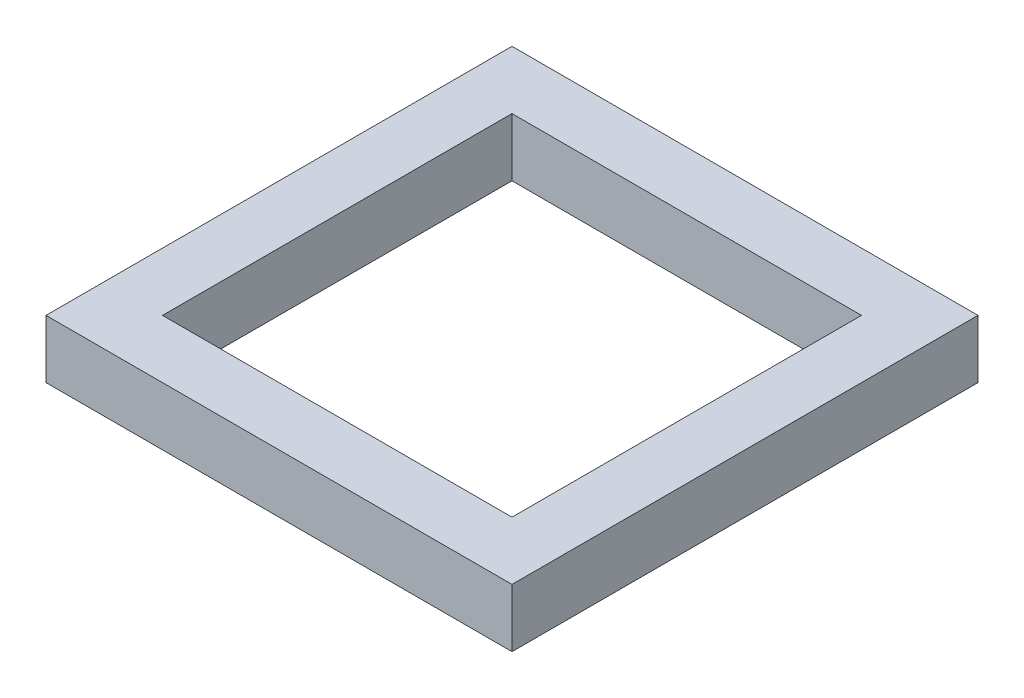
ISO-10303-21;
HEADER;
FILE_DESCRIPTION(('STEP AP214'),'2;1');
FILE_NAME('part.step','',(''),(''),'','','');
FILE_SCHEMA(('AUTOMOTIVE_DESIGN { 1 0 10303 214 1 1 1 1 }'));
ENDSEC;
DATA;
#1=APPLICATION_CONTEXT('core data for automotive mechanical design processes');
#2=APPLICATION_PROTOCOL_DEFINITION('international standard','automotive_design',2000,#1);
#3=PRODUCT_CONTEXT('',#1,'mechanical');
#4=PRODUCT('Part','Part','',(#3));
#5=PRODUCT_RELATED_PRODUCT_CATEGORY('part','',(#4));
#6=PRODUCT_DEFINITION_FORMATION('','',#4);
#7=PRODUCT_DEFINITION_CONTEXT('part definition',#1,'design');
#8=PRODUCT_DEFINITION('design','',#6,#7);
#9=PRODUCT_DEFINITION_SHAPE('','',#8);
#10=(LENGTH_UNIT() NAMED_UNIT(*) SI_UNIT(.MILLI.,.METRE.));
#11=(NAMED_UNIT(*) PLANE_ANGLE_UNIT() SI_UNIT($,.RADIAN.));
#12=(NAMED_UNIT(*) SI_UNIT($,.STERADIAN.) SOLID_ANGLE_UNIT());
#13=UNCERTAINTY_MEASURE_WITH_UNIT(LENGTH_MEASURE(1.E-05),#10,'distance_accuracy_value','');
#14=(GEOMETRIC_REPRESENTATION_CONTEXT(3) GLOBAL_UNCERTAINTY_ASSIGNED_CONTEXT((#13)) GLOBAL_UNIT_ASSIGNED_CONTEXT((#10,
#11,#12)) REPRESENTATION_CONTEXT('',''));
#15=CARTESIAN_POINT('',(0.,0.,0.));
#16=DIRECTION('',(0.,0.,1.));
#17=DIRECTION('',(1.,0.,0.));
#18=AXIS2_PLACEMENT_3D('',#15,#16,#17);
#19=CARTESIAN_POINT('',(-200.,628.685424933238,200.));
#20=DIRECTION('',(0.,0.,-1.));
#21=DIRECTION('',(-1.,0.,0.));
#22=AXIS2_PLACEMENT_3D('',#19,#20,#21);
#23=PLANE('',#22);
#24=DIRECTION('',(1.,0.,0.));
#25=VECTOR('',#24,1.);
#26=CARTESIAN_POINT('',(-200.,62.999999984,200.));
#27=LINE('',#26,#25);
#28=CARTESIAN_POINT('',(-200.,62.9999999840002,200.));
#29=VERTEX_POINT('',#28);
#30=CARTESIAN_POINT('',(200.,62.999999984,200.));
#31=VERTEX_POINT('',#30);
#32=EDGE_CURVE('E156',#29,#31,#27,.T.);
#33=ORIENTED_EDGE('',*,*,#32,.F.);
#34=DIRECTION('',(0.,-1.,0.));
#35=VECTOR('',#34,1.);
#36=CARTESIAN_POINT('',(-200.,628.685424933238,200.));
#37=LINE('',#36,#35);
#38=CARTESIAN_POINT('',(-200.,12.999999908,200.));
#39=VERTEX_POINT('',#38);
#40=EDGE_CURVE('E47',#29,#39,#37,.T.);
#41=ORIENTED_EDGE('',*,*,#40,.T.);
#42=DIRECTION('',(1.,0.,0.));
#43=VECTOR('',#42,1.);
#44=CARTESIAN_POINT('',(-200.,12.999999908,200.));
#45=LINE('',#44,#43);
#46=CARTESIAN_POINT('',(200.,12.999999908,200.));
#47=VERTEX_POINT('',#46);
#48=EDGE_CURVE('E130',#39,#47,#45,.T.);
#49=ORIENTED_EDGE('',*,*,#48,.T.);
#50=DIRECTION('',(0.,-1.,0.));
#51=VECTOR('',#50,1.);
#52=CARTESIAN_POINT('',(200.,628.685424933238,200.));
#53=LINE('',#52,#51);
#54=EDGE_CURVE('E133',#31,#47,#53,.T.);
#55=ORIENTED_EDGE('',*,*,#54,.F.);
#56=EDGE_LOOP('',(#33,#41,#49,#55));
#57=FACE_BOUND('',#56,.T.);
#58=ADVANCED_FACE('F32',(#57),#23,.F.);
#59=CARTESIAN_POINT('',(-200.,628.685424933238,200.));
#60=DIRECTION('',(1.,0.,0.));
#61=DIRECTION('',(0.,0.,-1.));
#62=AXIS2_PLACEMENT_3D('',#59,#60,#61);
#63=PLANE('',#62);
#64=DIRECTION('',(0.,0.,1.));
#65=VECTOR('',#64,1.);
#66=CARTESIAN_POINT('',(-200.,62.999999984,200.));
#67=LINE('',#66,#65);
#68=CARTESIAN_POINT('',(-200.,62.9999999840002,-200.));
#69=VERTEX_POINT('',#68);
#70=EDGE_CURVE('E159',#69,#29,#67,.T.);
#71=ORIENTED_EDGE('',*,*,#70,.F.);
#72=DIRECTION('',(0.,-1.,0.));
#73=VECTOR('',#72,1.);
#74=CARTESIAN_POINT('',(-200.,628.685424933238,-200.));
#75=LINE('',#74,#73);
#76=CARTESIAN_POINT('',(-200.,12.999999908,-200.));
#77=VERTEX_POINT('',#76);
#78=EDGE_CURVE('E136',#69,#77,#75,.T.);
#79=ORIENTED_EDGE('',*,*,#78,.T.);
#80=DIRECTION('',(0.,0.,1.));
#81=VECTOR('',#80,1.);
#82=CARTESIAN_POINT('',(-200.,12.999999908,200.));
#83=LINE('',#82,#81);
#84=EDGE_CURVE('E128',#77,#39,#83,.T.);
#85=ORIENTED_EDGE('',*,*,#84,.T.);
#86=ORIENTED_EDGE('',*,*,#40,.F.);
#87=EDGE_LOOP('',(#71,#79,#85,#86));
#88=FACE_BOUND('',#87,.T.);
#89=ADVANCED_FACE('F158',(#88),#63,.F.);
#90=CARTESIAN_POINT('',(-200.,628.685424933238,-200.));
#91=DIRECTION('',(0.,0.,1.));
#92=DIRECTION('',(1.,0.,0.));
#93=AXIS2_PLACEMENT_3D('',#90,#91,#92);
#94=PLANE('',#93);
#95=DIRECTION('',(-1.,0.,0.));
#96=VECTOR('',#95,1.);
#97=CARTESIAN_POINT('',(-200.,62.999999984,-200.));
#98=LINE('',#97,#96);
#99=CARTESIAN_POINT('',(200.,62.9999999840002,-200.));
#100=VERTEX_POINT('',#99);
#101=EDGE_CURVE('E144',#100,#69,#98,.T.);
#102=ORIENTED_EDGE('',*,*,#101,.F.);
#103=DIRECTION('',(0.,-1.,0.));
#104=VECTOR('',#103,1.);
#105=CARTESIAN_POINT('',(200.,628.685424933238,-200.));
#106=LINE('',#105,#104);
#107=CARTESIAN_POINT('',(200.,12.999999908,-200.));
#108=VERTEX_POINT('',#107);
#109=EDGE_CURVE('E40',#100,#108,#106,.T.);
#110=ORIENTED_EDGE('',*,*,#109,.T.);
#111=DIRECTION('',(-1.,0.,0.));
#112=VECTOR('',#111,1.);
#113=CARTESIAN_POINT('',(-200.,12.999999908,-200.));
#114=LINE('',#113,#112);
#115=EDGE_CURVE('E125',#108,#77,#114,.T.);
#116=ORIENTED_EDGE('',*,*,#115,.T.);
#117=ORIENTED_EDGE('',*,*,#78,.F.);
#118=EDGE_LOOP('',(#102,#110,#116,#117));
#119=FACE_BOUND('',#118,.T.);
#120=ADVANCED_FACE('F140',(#119),#94,.F.);
#121=CARTESIAN_POINT('',(200.,628.685424933238,200.));
#122=DIRECTION('',(-1.,0.,0.));
#123=DIRECTION('',(0.,0.,1.));
#124=AXIS2_PLACEMENT_3D('',#121,#122,#123);
#125=PLANE('',#124);
#126=DIRECTION('',(0.,0.,-1.));
#127=VECTOR('',#126,1.);
#128=CARTESIAN_POINT('',(200.,62.999999984,200.));
#129=LINE('',#128,#127);
#130=EDGE_CURVE('E153',#31,#100,#129,.T.);
#131=ORIENTED_EDGE('',*,*,#130,.F.);
#132=ORIENTED_EDGE('',*,*,#54,.T.);
#133=DIRECTION('',(0.,0.,-1.));
#134=VECTOR('',#133,1.);
#135=CARTESIAN_POINT('',(200.,12.999999908,200.));
#136=LINE('',#135,#134);
#137=EDGE_CURVE('E122',#47,#108,#136,.T.);
#138=ORIENTED_EDGE('',*,*,#137,.T.);
#139=ORIENTED_EDGE('',*,*,#109,.F.);
#140=EDGE_LOOP('',(#131,#132,#138,#139));
#141=FACE_BOUND('',#140,.T.);
#142=ADVANCED_FACE('F34',(#141),#125,.F.);
#143=CARTESIAN_POINT('',(0.,12.999999908,0.));
#144=DIRECTION('',(0.,-1.,0.));
#145=DIRECTION('',(0.,0.,-1.));
#146=AXIS2_PLACEMENT_3D('',#143,#144,#145);
#147=PLANE('',#146);
#148=ORIENTED_EDGE('',*,*,#137,.F.);
#149=ORIENTED_EDGE('',*,*,#48,.F.);
#150=ORIENTED_EDGE('',*,*,#84,.F.);
#151=ORIENTED_EDGE('',*,*,#115,.F.);
#152=EDGE_LOOP('',(#148,#149,#150,#151));
#153=FACE_BOUND('',#152,.T.);
#154=DIRECTION('',(1.,0.,0.));
#155=VECTOR('',#154,1.);
#156=CARTESIAN_POINT('',(-150.,12.999999908,150.));
#157=LINE('',#156,#155);
#158=CARTESIAN_POINT('',(-150.,12.999999908,150.));
#159=VERTEX_POINT('',#158);
#160=CARTESIAN_POINT('',(150.,12.999999908,150.));
#161=VERTEX_POINT('',#160);
#162=EDGE_CURVE('E112',#159,#161,#157,.T.);
#163=ORIENTED_EDGE('',*,*,#162,.T.);
#164=DIRECTION('',(0.,0.,-1.));
#165=VECTOR('',#164,1.);
#166=CARTESIAN_POINT('',(150.,12.999999908,150.));
#167=LINE('',#166,#165);
#168=CARTESIAN_POINT('',(150.,12.999999908,-150.));
#169=VERTEX_POINT('',#168);
#170=EDGE_CURVE('E161',#161,#169,#167,.T.);
#171=ORIENTED_EDGE('',*,*,#170,.T.);
#172=DIRECTION('',(-1.,0.,0.));
#173=VECTOR('',#172,1.);
#174=CARTESIAN_POINT('',(-150.,12.999999908,-150.));
#175=LINE('',#174,#173);
#176=CARTESIAN_POINT('',(-150.,12.999999908,-150.));
#177=VERTEX_POINT('',#176);
#178=EDGE_CURVE('E168',#169,#177,#175,.T.);
#179=ORIENTED_EDGE('',*,*,#178,.T.);
#180=DIRECTION('',(0.,0.,1.));
#181=VECTOR('',#180,1.);
#182=CARTESIAN_POINT('',(-150.,12.999999908,150.));
#183=LINE('',#182,#181);
#184=EDGE_CURVE('E171',#177,#159,#183,.T.);
#185=ORIENTED_EDGE('',*,*,#184,.T.);
#186=EDGE_LOOP('',(#163,#171,#179,#185));
#187=FACE_BOUND('',#186,.T.);
#188=ADVANCED_FACE('F150',(#153,#187),#147,.T.);
#189=CARTESIAN_POINT('',(-150.,628.685424933238,150.));
#190=DIRECTION('',(0.,0.,-1.));
#191=DIRECTION('',(-1.,0.,0.));
#192=AXIS2_PLACEMENT_3D('',#189,#190,#191);
#193=PLANE('',#192);
#194=DIRECTION('',(0.,-1.,0.));
#195=VECTOR('',#194,1.);
#196=CARTESIAN_POINT('',(-150.,628.685424933238,150.));
#197=LINE('',#196,#195);
#198=CARTESIAN_POINT('',(-150.,62.999999984,150.));
#199=VERTEX_POINT('',#198);
#200=EDGE_CURVE('E104',#199,#159,#197,.T.);
#201=ORIENTED_EDGE('',*,*,#200,.F.);
#202=DIRECTION('',(1.,0.,0.));
#203=VECTOR('',#202,1.);
#204=CARTESIAN_POINT('',(-150.,62.999999984,150.));
#205=LINE('',#204,#203);
#206=CARTESIAN_POINT('',(150.,62.9999999840002,150.));
#207=VERTEX_POINT('',#206);
#208=EDGE_CURVE('E11',#199,#207,#205,.T.);
#209=ORIENTED_EDGE('',*,*,#208,.T.);
#210=DIRECTION('',(0.,-1.,0.));
#211=VECTOR('',#210,1.);
#212=CARTESIAN_POINT('',(150.,628.685424933238,150.));
#213=LINE('',#212,#211);
#214=EDGE_CURVE('E114',#207,#161,#213,.T.);
#215=ORIENTED_EDGE('',*,*,#214,.T.);
#216=ORIENTED_EDGE('',*,*,#162,.F.);
#217=EDGE_LOOP('',(#201,#209,#215,#216));
#218=FACE_BOUND('',#217,.T.);
#219=ADVANCED_FACE('F110',(#218),#193,.T.);
#220=CARTESIAN_POINT('',(-150.,628.685424933238,150.));
#221=DIRECTION('',(1.,0.,0.));
#222=DIRECTION('',(0.,0.,-1.));
#223=AXIS2_PLACEMENT_3D('',#220,#221,#222);
#224=PLANE('',#223);
#225=DIRECTION('',(0.,-1.,0.));
#226=VECTOR('',#225,1.);
#227=CARTESIAN_POINT('',(-150.,628.685424933238,-150.));
#228=LINE('',#227,#226);
#229=CARTESIAN_POINT('',(-150.,62.999999984,-150.));
#230=VERTEX_POINT('',#229);
#231=EDGE_CURVE('E106',#230,#177,#228,.T.);
#232=ORIENTED_EDGE('',*,*,#231,.F.);
#233=DIRECTION('',(0.,0.,1.));
#234=VECTOR('',#233,1.);
#235=CARTESIAN_POINT('',(-150.,62.999999984,150.));
#236=LINE('',#235,#234);
#237=EDGE_CURVE('E97',#230,#199,#236,.T.);
#238=ORIENTED_EDGE('',*,*,#237,.T.);
#239=ORIENTED_EDGE('',*,*,#200,.T.);
#240=ORIENTED_EDGE('',*,*,#184,.F.);
#241=EDGE_LOOP('',(#232,#238,#239,#240));
#242=FACE_BOUND('',#241,.T.);
#243=ADVANCED_FACE('F102',(#242),#224,.T.);
#244=CARTESIAN_POINT('',(-150.,628.685424933238,-150.));
#245=DIRECTION('',(0.,0.,1.));
#246=DIRECTION('',(1.,0.,0.));
#247=AXIS2_PLACEMENT_3D('',#244,#245,#246);
#248=PLANE('',#247);
#249=DIRECTION('',(0.,-1.,0.));
#250=VECTOR('',#249,1.);
#251=CARTESIAN_POINT('',(150.,628.685424933238,-150.));
#252=LINE('',#251,#250);
#253=CARTESIAN_POINT('',(150.,62.999999984,-150.));
#254=VERTEX_POINT('',#253);
#255=EDGE_CURVE('E116',#254,#169,#252,.T.);
#256=ORIENTED_EDGE('',*,*,#255,.F.);
#257=DIRECTION('',(-1.,0.,0.));
#258=VECTOR('',#257,1.);
#259=CARTESIAN_POINT('',(-150.,62.999999984,-150.));
#260=LINE('',#259,#258);
#261=EDGE_CURVE('E108',#254,#230,#260,.T.);
#262=ORIENTED_EDGE('',*,*,#261,.T.);
#263=ORIENTED_EDGE('',*,*,#231,.T.);
#264=ORIENTED_EDGE('',*,*,#178,.F.);
#265=EDGE_LOOP('',(#256,#262,#263,#264));
#266=FACE_BOUND('',#265,.T.);
#267=ADVANCED_FACE('F176',(#266),#248,.T.);
#268=CARTESIAN_POINT('',(150.,628.685424933238,150.));
#269=DIRECTION('',(-1.,0.,0.));
#270=DIRECTION('',(0.,0.,1.));
#271=AXIS2_PLACEMENT_3D('',#268,#269,#270);
#272=PLANE('',#271);
#273=ORIENTED_EDGE('',*,*,#214,.F.);
#274=DIRECTION('',(0.,0.,-1.));
#275=VECTOR('',#274,1.);
#276=CARTESIAN_POINT('',(150.,62.999999984,150.));
#277=LINE('',#276,#275);
#278=EDGE_CURVE('E55',#207,#254,#277,.T.);
#279=ORIENTED_EDGE('',*,*,#278,.T.);
#280=ORIENTED_EDGE('',*,*,#255,.T.);
#281=ORIENTED_EDGE('',*,*,#170,.F.);
#282=EDGE_LOOP('',(#273,#279,#280,#281));
#283=FACE_BOUND('',#282,.T.);
#284=ADVANCED_FACE('F180',(#283),#272,.T.);
#285=CARTESIAN_POINT('',(0.,62.999999984,0.));
#286=DIRECTION('',(0.,1.,0.));
#287=DIRECTION('',(0.,0.,1.));
#288=AXIS2_PLACEMENT_3D('',#285,#286,#287);
#289=PLANE('',#288);
#290=ORIENTED_EDGE('',*,*,#278,.F.);
#291=ORIENTED_EDGE('',*,*,#208,.F.);
#292=ORIENTED_EDGE('',*,*,#237,.F.);
#293=ORIENTED_EDGE('',*,*,#261,.F.);
#294=EDGE_LOOP('',(#290,#291,#292,#293));
#295=FACE_BOUND('',#294,.T.);
#296=ORIENTED_EDGE('',*,*,#32,.T.);
#297=ORIENTED_EDGE('',*,*,#130,.T.);
#298=ORIENTED_EDGE('',*,*,#101,.T.);
#299=ORIENTED_EDGE('',*,*,#70,.T.);
#300=EDGE_LOOP('',(#296,#297,#298,#299));
#301=FACE_BOUND('',#300,.T.);
#302=ADVANCED_FACE('F95',(#295,#301),#289,.T.);
#303=CLOSED_SHELL('',(#58,#89,#120,#142,#188,#219,#243,#267,#284,#302));
#304=MANIFOLD_SOLID_BREP('B2',#303);
#305=ADVANCED_BREP_SHAPE_REPRESENTATION('',(#18,#304),#14);
#306=SHAPE_DEFINITION_REPRESENTATION(#9,#305);
ENDSEC;
END-ISO-10303-21;
